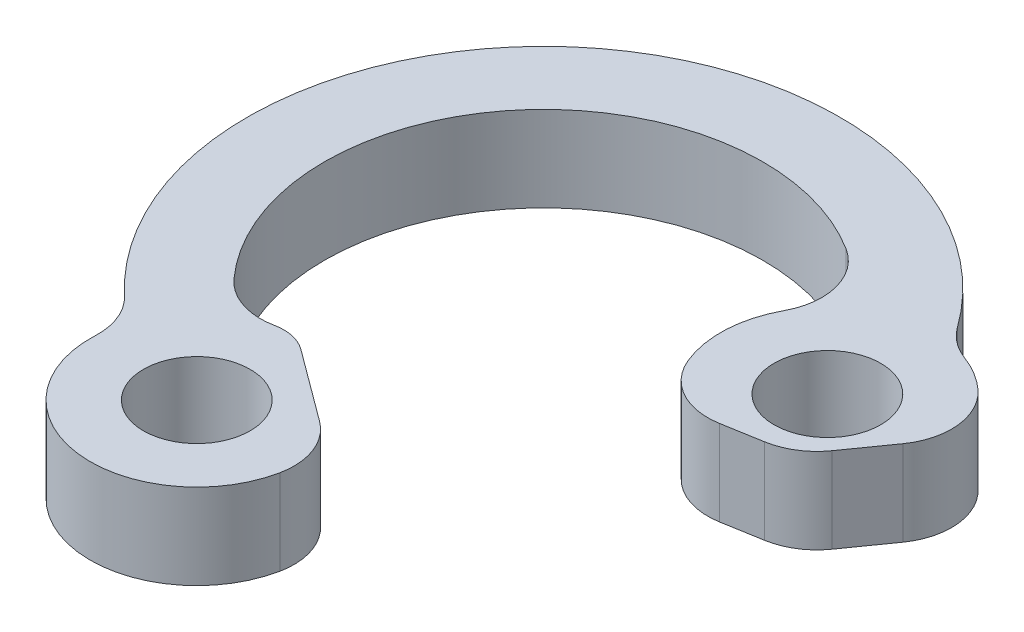
ISO-10303-21;
HEADER;
FILE_DESCRIPTION(('STEP AP214'),'2;1');
FILE_NAME('part.step','',(''),(''),'','','');
FILE_SCHEMA(('AUTOMOTIVE_DESIGN { 1 0 10303 214 1 1 1 1 }'));
ENDSEC;
DATA;
#1=APPLICATION_CONTEXT('core data for automotive mechanical design processes');
#2=APPLICATION_PROTOCOL_DEFINITION('international standard','automotive_design',2000,#1);
#3=PRODUCT_CONTEXT('',#1,'mechanical');
#4=PRODUCT('Part','Part','',(#3));
#5=PRODUCT_RELATED_PRODUCT_CATEGORY('part','',(#4));
#6=PRODUCT_DEFINITION_FORMATION('','',#4);
#7=PRODUCT_DEFINITION_CONTEXT('part definition',#1,'design');
#8=PRODUCT_DEFINITION('design','',#6,#7);
#9=PRODUCT_DEFINITION_SHAPE('','',#8);
#10=(LENGTH_UNIT() NAMED_UNIT(*) SI_UNIT(.MILLI.,.METRE.));
#11=(NAMED_UNIT(*) PLANE_ANGLE_UNIT() SI_UNIT($,.RADIAN.));
#12=(NAMED_UNIT(*) SI_UNIT($,.STERADIAN.) SOLID_ANGLE_UNIT());
#13=UNCERTAINTY_MEASURE_WITH_UNIT(LENGTH_MEASURE(1.E-05),#10,'distance_accuracy_value','');
#14=(GEOMETRIC_REPRESENTATION_CONTEXT(3) GLOBAL_UNCERTAINTY_ASSIGNED_CONTEXT((#13)) GLOBAL_UNIT_ASSIGNED_CONTEXT((#10,
#11,#12)) REPRESENTATION_CONTEXT('',''));
#15=CARTESIAN_POINT('',(0.,0.,0.));
#16=DIRECTION('',(0.,0.,1.));
#17=DIRECTION('',(1.,0.,0.));
#18=AXIS2_PLACEMENT_3D('',#15,#16,#17);
#19=CARTESIAN_POINT('',(87.073540725093,4.,-81.0463030698259));
#20=DIRECTION('',(0.,-1.,0.));
#21=DIRECTION('',(0.,0.,-1.));
#22=AXIS2_PLACEMENT_3D('',#19,#20,#21);
#23=CYLINDRICAL_SURFACE('',#22,5.00000000000037);
#24=CARTESIAN_POINT('',(87.073540725093,4.,-81.0463030698259));
#25=DIRECTION('',(0.,1.,0.));
#26=DIRECTION('',(0.,0.,1.));
#27=AXIS2_PLACEMENT_3D('',#24,#25,#26);
#28=CIRCLE('',#27,5.00000000000037);
#29=CARTESIAN_POINT('',(90.4170132831093,4.,-84.7639893467722));
#30=VERTEX_POINT('',#29);
#31=CARTESIAN_POINT('',(88.8112972997375,4.,-85.7346078900443));
#32=VERTEX_POINT('',#31);
#33=EDGE_CURVE('E303',#30,#32,#28,.T.);
#34=ORIENTED_EDGE('',*,*,#33,.F.);
#35=DIRECTION('',(0.,-1.,0.));
#36=VECTOR('',#35,1.);
#37=CARTESIAN_POINT('',(90.4170132831093,4.,-84.7639893467722));
#38=LINE('',#37,#36);
#39=CARTESIAN_POINT('',(90.4170132831093,0.,-84.7639893467722));
#40=VERTEX_POINT('',#39);
#41=EDGE_CURVE('E253',#30,#40,#38,.T.);
#42=ORIENTED_EDGE('',*,*,#41,.T.);
#43=CARTESIAN_POINT('',(87.073540725093,0.,-81.0463030698259));
#44=DIRECTION('',(0.,1.,0.));
#45=DIRECTION('',(0.,0.,1.));
#46=AXIS2_PLACEMENT_3D('',#43,#44,#45);
#47=CIRCLE('',#46,5.00000000000037);
#48=CARTESIAN_POINT('',(88.8112972997375,0.,-85.7346078900443));
#49=VERTEX_POINT('',#48);
#50=EDGE_CURVE('E276',#40,#49,#47,.T.);
#51=ORIENTED_EDGE('',*,*,#50,.T.);
#52=DIRECTION('',(0.,-1.,0.));
#53=VECTOR('',#52,1.);
#54=CARTESIAN_POINT('',(88.8112972997375,4.,-85.7346078900443));
#55=LINE('',#54,#53);
#56=EDGE_CURVE('E206',#49,#32,#55,.F.);
#57=ORIENTED_EDGE('',*,*,#56,.T.);
#58=EDGE_LOOP('',(#34,#42,#51,#57));
#59=FACE_BOUND('',#58,.T.);
#60=ADVANCED_FACE('F39',(#59),#23,.T.);
#61=CARTESIAN_POINT('',(82.6696468529154,0.,-83.4139429838754));
#62=VERTEX_POINT('',#61);
#63=CARTESIAN_POINT('',(82.4546959815146,0.,-79.1315515886351));
#64=VERTEX_POINT('',#63);
#65=EDGE_CURVE('E194',#62,#64,#47,.T.);
#66=ORIENTED_EDGE('',*,*,#65,.T.);
#67=DIRECTION('',(0.,-1.,0.));
#68=VECTOR('',#67,1.);
#69=CARTESIAN_POINT('',(82.4546959815146,4.,-79.1315515886351));
#70=LINE('',#69,#68);
#71=CARTESIAN_POINT('',(82.4546959815146,4.,-79.1315515886351));
#72=VERTEX_POINT('',#71);
#73=EDGE_CURVE('E255',#64,#72,#70,.F.);
#74=ORIENTED_EDGE('',*,*,#73,.T.);
#75=CARTESIAN_POINT('',(82.6696468529154,4.,-83.4139429838754));
#76=VERTEX_POINT('',#75);
#77=EDGE_CURVE('E284',#76,#72,#28,.T.);
#78=ORIENTED_EDGE('',*,*,#77,.F.);
#79=DIRECTION('',(0.,-1.,0.));
#80=VECTOR('',#79,1.);
#81=CARTESIAN_POINT('',(82.6696468529154,4.,-83.4139429838754));
#82=LINE('',#81,#80);
#83=EDGE_CURVE('E171',#76,#62,#82,.T.);
#84=ORIENTED_EDGE('',*,*,#83,.T.);
#85=EDGE_LOOP('',(#66,#74,#78,#84));
#86=FACE_BOUND('',#85,.T.);
#87=ADVANCED_FACE('F272',(#86),#23,.T.);
#88=CARTESIAN_POINT('',(76.1332406955767,4.,-78.6847831495273));
#89=DIRECTION('',(0.,-1.,0.));
#90=DIRECTION('',(0.,0.,-1.));
#91=AXIS2_PLACEMENT_3D('',#88,#89,#90);
#92=CYLINDRICAL_SURFACE('',#91,13.8977179632817);
#93=CARTESIAN_POINT('',(76.1332406955767,0.,-78.6847831495273));
#94=DIRECTION('',(0.,1.,0.));
#95=DIRECTION('',(0.,0.,1.));
#96=AXIS2_PLACEMENT_3D('',#93,#94,#95);
#97=CIRCLE('',#96,13.8977179632817);
#98=CARTESIAN_POINT('',(87.4179932212996,0.,-86.7965600831045));
#99=VERTEX_POINT('',#98);
#100=CARTESIAN_POINT('',(66.6039727055799,0.,-68.5684786779456));
#101=VERTEX_POINT('',#100);
#102=EDGE_CURVE('E189',#99,#101,#97,.T.);
#103=ORIENTED_EDGE('',*,*,#102,.T.);
#104=DIRECTION('',(0.,-1.,0.));
#105=VECTOR('',#104,1.);
#106=CARTESIAN_POINT('',(66.6039727055799,4.,-68.5684786779456));
#107=LINE('',#106,#105);
#108=CARTESIAN_POINT('',(66.6039727055799,4.,-68.5684786779456));
#109=VERTEX_POINT('',#108);
#110=EDGE_CURVE('E165',#101,#109,#107,.F.);
#111=ORIENTED_EDGE('',*,*,#110,.T.);
#112=CARTESIAN_POINT('',(76.1332406955767,4.,-78.6847831495273));
#113=DIRECTION('',(0.,1.,0.));
#114=DIRECTION('',(0.,0.,1.));
#115=AXIS2_PLACEMENT_3D('',#112,#113,#114);
#116=CIRCLE('',#115,13.8977179632817);
#117=CARTESIAN_POINT('',(87.4179932212996,4.,-86.7965600831045));
#118=VERTEX_POINT('',#117);
#119=EDGE_CURVE('E305',#118,#109,#116,.T.);
#120=ORIENTED_EDGE('',*,*,#119,.F.);
#121=DIRECTION('',(0.,-1.,0.));
#122=VECTOR('',#121,1.);
#123=CARTESIAN_POINT('',(87.4179932212996,4.,-86.7965600831045));
#124=LINE('',#123,#122);
#125=EDGE_CURVE('E182',#118,#99,#124,.T.);
#126=ORIENTED_EDGE('',*,*,#125,.T.);
#127=EDGE_LOOP('',(#103,#111,#120,#126));
#128=FACE_BOUND('',#127,.T.);
#129=ADVANCED_FACE('F329',(#128),#92,.T.);
#130=CARTESIAN_POINT('',(72.5386555288346,4.,-66.0203582136987));
#131=DIRECTION('',(0.,-1.,0.));
#132=DIRECTION('',(0.,0.,-1.));
#133=AXIS2_PLACEMENT_3D('',#130,#131,#132);
#134=CYLINDRICAL_SURFACE('',#133,5.);
#135=CARTESIAN_POINT('',(72.5386555288346,0.,-66.0203582136987));
#136=DIRECTION('',(0.,1.,0.));
#137=DIRECTION('',(0.,0.,1.));
#138=AXIS2_PLACEMENT_3D('',#135,#136,#137);
#139=CIRCLE('',#138,5.);
#140=CARTESIAN_POINT('',(67.5438448545858,0.,-66.2481000157703));
#141=VERTEX_POINT('',#140);
#142=CARTESIAN_POINT('',(77.43812650501,0.,-65.02276904294));
#143=VERTEX_POINT('',#142);
#144=EDGE_CURVE('E178',#141,#143,#139,.T.);
#145=ORIENTED_EDGE('',*,*,#144,.T.);
#146=DIRECTION('',(0.,-1.,0.));
#147=VECTOR('',#146,1.);
#148=CARTESIAN_POINT('',(77.43812650501,4.,-65.02276904294));
#149=LINE('',#148,#147);
#150=CARTESIAN_POINT('',(77.43812650501,4.,-65.02276904294));
#151=VERTEX_POINT('',#150);
#152=EDGE_CURVE('E228',#143,#151,#149,.F.);
#153=ORIENTED_EDGE('',*,*,#152,.T.);
#154=CARTESIAN_POINT('',(72.5386555288346,4.,-66.0203582136987));
#155=DIRECTION('',(0.,1.,0.));
#156=DIRECTION('',(0.,0.,1.));
#157=AXIS2_PLACEMENT_3D('',#154,#155,#156);
#158=CIRCLE('',#157,5.);
#159=CARTESIAN_POINT('',(67.5438448545858,4.,-66.2481000157703));
#160=VERTEX_POINT('',#159);
#161=EDGE_CURVE('E181',#160,#151,#158,.T.);
#162=ORIENTED_EDGE('',*,*,#161,.F.);
#163=DIRECTION('',(0.,-1.,0.));
#164=VECTOR('',#163,1.);
#165=CARTESIAN_POINT('',(67.5438448545858,4.,-66.2481000157703));
#166=LINE('',#165,#164);
#167=EDGE_CURVE('E164',#160,#141,#166,.T.);
#168=ORIENTED_EDGE('',*,*,#167,.T.);
#169=EDGE_LOOP('',(#145,#153,#162,#168));
#170=FACE_BOUND('',#169,.T.);
#171=ADVANCED_FACE('F176',(#170),#134,.T.);
#172=CARTESIAN_POINT('',(72.5386555288346,4.,-66.0203582136987));
#173=DIRECTION('',(0.,-1.,0.));
#174=DIRECTION('',(0.,0.,-1.));
#175=AXIS2_PLACEMENT_3D('',#172,#173,#174);
#176=CYLINDRICAL_SURFACE('',#175,2.5);
#177=CARTESIAN_POINT('',(72.5386555288346,4.,-66.0203582136987));
#178=DIRECTION('',(0.,1.,0.));
#179=DIRECTION('',(0.,0.,1.));
#180=AXIS2_PLACEMENT_3D('',#177,#178,#179);
#181=CIRCLE('',#180,2.5);
#182=CARTESIAN_POINT('',(72.5386555288346,4.,-63.5203582136987));
#183=VERTEX_POINT('',#182);
#184=EDGE_CURVE('E300',#183,#183,#181,.T.);
#185=ORIENTED_EDGE('',*,*,#184,.T.);
#186=EDGE_LOOP('',(#185));
#187=FACE_BOUND('',#186,.T.);
#188=CARTESIAN_POINT('',(72.5386555288346,0.,-66.0203582136987));
#189=DIRECTION('',(0.,1.,0.));
#190=DIRECTION('',(0.,0.,1.));
#191=AXIS2_PLACEMENT_3D('',#188,#189,#190);
#192=CIRCLE('',#191,2.5);
#193=CARTESIAN_POINT('',(72.5386555288346,0.,-63.5203582136987));
#194=VERTEX_POINT('',#193);
#195=EDGE_CURVE('E313',#194,#194,#192,.T.);
#196=ORIENTED_EDGE('',*,*,#195,.F.);
#197=EDGE_LOOP('',(#196));
#198=FACE_BOUND('',#197,.T.);
#199=ADVANCED_FACE('F337',(#187,#198),#176,.F.);
#200=CARTESIAN_POINT('',(87.073540725093,4.,-81.0463030698259));
#201=DIRECTION('',(0.,-1.,0.));
#202=DIRECTION('',(0.,0.,-1.));
#203=AXIS2_PLACEMENT_3D('',#200,#201,#202);
#204=CYLINDRICAL_SURFACE('',#203,2.5);
#205=CARTESIAN_POINT('',(87.073540725093,4.,-81.0463030698259));
#206=DIRECTION('',(0.,1.,0.));
#207=DIRECTION('',(0.,0.,1.));
#208=AXIS2_PLACEMENT_3D('',#205,#206,#207);
#209=CIRCLE('',#208,2.5);
#210=CARTESIAN_POINT('',(87.073540725093,4.,-78.5463030698259));
#211=VERTEX_POINT('',#210);
#212=EDGE_CURVE('E192',#211,#211,#209,.T.);
#213=ORIENTED_EDGE('',*,*,#212,.T.);
#214=EDGE_LOOP('',(#213));
#215=FACE_BOUND('',#214,.T.);
#216=CARTESIAN_POINT('',(87.073540725093,0.,-81.0463030698259));
#217=DIRECTION('',(0.,1.,0.));
#218=DIRECTION('',(0.,0.,1.));
#219=AXIS2_PLACEMENT_3D('',#216,#217,#218);
#220=CIRCLE('',#219,2.5);
#221=CARTESIAN_POINT('',(87.073540725093,0.,-78.5463030698259));
#222=VERTEX_POINT('',#221);
#223=EDGE_CURVE('E297',#222,#222,#220,.T.);
#224=ORIENTED_EDGE('',*,*,#223,.F.);
#225=EDGE_LOOP('',(#224));
#226=FACE_BOUND('',#225,.T.);
#227=ADVANCED_FACE('F349',(#215,#226),#204,.F.);
#228=CARTESIAN_POINT('',(76.1332406955767,4.,-78.6847831495273));
#229=DIRECTION('',(0.,-1.,0.));
#230=DIRECTION('',(0.,0.,-1.));
#231=AXIS2_PLACEMENT_3D('',#228,#229,#230);
#232=CYLINDRICAL_SURFACE('',#231,10.2789510553467);
#233=CARTESIAN_POINT('',(76.1332406955767,4.,-78.6847831495273));
#234=DIRECTION('',(0.,1.,0.));
#235=DIRECTION('',(0.,0.,1.));
#236=AXIS2_PLACEMENT_3D('',#233,#234,#235);
#237=CIRCLE('',#236,10.2789510553467);
#238=CARTESIAN_POINT('',(81.6322408847205,4.,-87.369127207544));
#239=VERTEX_POINT('',#238);
#240=CARTESIAN_POINT('',(68.4970170332686,4.,-71.80401844076));
#241=VERTEX_POINT('',#240);
#242=EDGE_CURVE('E183',#239,#241,#237,.T.);
#243=ORIENTED_EDGE('',*,*,#242,.T.);
#244=DIRECTION('',(0.,-1.,0.));
#245=VECTOR('',#244,1.);
#246=CARTESIAN_POINT('',(68.4970170332686,4.,-71.80401844076));
#247=LINE('',#246,#245);
#248=CARTESIAN_POINT('',(68.4970170332686,0.,-71.80401844076));
#249=VERTEX_POINT('',#248);
#250=EDGE_CURVE('E203',#241,#249,#247,.T.);
#251=ORIENTED_EDGE('',*,*,#250,.T.);
#252=CARTESIAN_POINT('',(76.1332406955767,0.,-78.6847831495273));
#253=DIRECTION('',(0.,1.,0.));
#254=DIRECTION('',(0.,0.,1.));
#255=AXIS2_PLACEMENT_3D('',#252,#253,#254);
#256=CIRCLE('',#255,10.2789510553467);
#257=CARTESIAN_POINT('',(81.6322408847205,0.,-87.369127207544));
#258=VERTEX_POINT('',#257);
#259=EDGE_CURVE('E188',#258,#249,#256,.T.);
#260=ORIENTED_EDGE('',*,*,#259,.F.);
#261=DIRECTION('',(0.,-1.,0.));
#262=VECTOR('',#261,1.);
#263=CARTESIAN_POINT('',(81.6322408847205,4.,-87.369127207544));
#264=LINE('',#263,#262);
#265=EDGE_CURVE('E201',#258,#239,#264,.F.);
#266=ORIENTED_EDGE('',*,*,#265,.T.);
#267=EDGE_LOOP('',(#243,#251,#260,#266));
#268=FACE_BOUND('',#267,.T.);
#269=ADVANCED_FACE('F352',(#268),#232,.F.);
#270=CARTESIAN_POINT('',(0.,4.,0.));
#271=DIRECTION('',(0.,1.,0.));
#272=DIRECTION('',(0.,0.,1.));
#273=AXIS2_PLACEMENT_3D('',#270,#271,#272);
#274=PLANE('',#273);
#275=ORIENTED_EDGE('',*,*,#77,.T.);
#276=CARTESIAN_POINT('',(85.2260028276614,4.,-80.2804024773495));
#277=DIRECTION('',(0.,1.,0.));
#278=DIRECTION('',(0.,0.,1.));
#279=AXIS2_PLACEMENT_3D('',#276,#277,#278);
#280=CIRCLE('',#279,3.);
#281=CARTESIAN_POINT('',(85.735483711979,4.,-77.3239807840664));
#282=VERTEX_POINT('',#281);
#283=EDGE_CURVE('E260',#72,#282,#280,.T.);
#284=ORIENTED_EDGE('',*,*,#283,.T.);
#285=DIRECTION('',(-0.985473897761035,0.,0.169826961439203));
#286=VECTOR('',#285,1.);
#287=CARTESIAN_POINT('',(88.7700332886994,4.,-77.8469254659315));
#288=LINE('',#287,#286);
#289=CARTESIAN_POINT('',(87.5472284238743,4.,-77.6361992000221));
#290=VERTEX_POINT('',#289);
#291=EDGE_CURVE('E282',#290,#282,#288,.T.);
#292=ORIENTED_EDGE('',*,*,#291,.F.);
#293=CARTESIAN_POINT('',(87.0377475395567,4.,-80.5926208933053));
#294=DIRECTION('',(0.,1.,0.));
#295=DIRECTION('',(0.,0.,1.));
#296=AXIS2_PLACEMENT_3D('',#293,#294,#295);
#297=CIRCLE('',#296,3.);
#298=CARTESIAN_POINT('',(89.4867256076639,4.,-78.8598466951104));
#299=VERTEX_POINT('',#298);
#300=EDGE_CURVE('E258',#290,#299,#297,.T.);
#301=ORIENTED_EDGE('',*,*,#300,.T.);
#302=DIRECTION('',(-0.577591399398297,0.,0.816326022702399));
#303=VECTOR('',#302,1.);
#304=CARTESIAN_POINT('',(91.9156832743271,4.,-82.2927602623921));
#305=LINE('',#304,#303);
#306=CARTESIAN_POINT('',(90.8599078164069,4.,-80.8006033824097));
#307=VERTEX_POINT('',#306);
#308=EDGE_CURVE('E287',#307,#299,#305,.T.);
#309=ORIENTED_EDGE('',*,*,#308,.F.);
#310=CARTESIAN_POINT('',(88.4109297482997,4.,-82.5333775806046));
#311=DIRECTION('',(0.,1.,0.));
#312=DIRECTION('',(0.,0.,1.));
#313=AXIS2_PLACEMENT_3D('',#310,#311,#312);
#314=CIRCLE('',#313,3.);
#315=EDGE_CURVE('E246',#307,#30,#314,.T.);
#316=ORIENTED_EDGE('',*,*,#315,.T.);
#317=ORIENTED_EDGE('',*,*,#33,.T.);
#318=CARTESIAN_POINT('',(89.8539512445242,4.,-88.5475907821751));
#319=DIRECTION('',(0.,1.,0.));
#320=DIRECTION('',(0.,0.,1.));
#321=AXIS2_PLACEMENT_3D('',#318,#319,#320);
#322=CIRCLE('',#321,3.);
#323=EDGE_CURVE('E224',#32,#118,#322,.F.);
#324=ORIENTED_EDGE('',*,*,#323,.T.);
#325=ORIENTED_EDGE('',*,*,#119,.T.);
#326=CARTESIAN_POINT('',(64.5469584500366,4.,-66.3847450970133));
#327=DIRECTION('',(0.,1.,0.));
#328=DIRECTION('',(0.,0.,1.));
#329=AXIS2_PLACEMENT_3D('',#326,#327,#328);
#330=CIRCLE('',#329,3.);
#331=EDGE_CURVE('E170',#109,#160,#330,.F.);
#332=ORIENTED_EDGE('',*,*,#331,.T.);
#333=ORIENTED_EDGE('',*,*,#161,.T.);
#334=CARTESIAN_POINT('',(74.4984439193047,4.,-65.6213225453952));
#335=DIRECTION('',(0.,1.,0.));
#336=DIRECTION('',(0.,0.,1.));
#337=AXIS2_PLACEMENT_3D('',#334,#335,#336);
#338=CIRCLE('',#337,3.);
#339=CARTESIAN_POINT('',(76.2816528178533,4.,-68.0338245711223));
#340=VERTEX_POINT('',#339);
#341=EDGE_CURVE('E230',#151,#340,#338,.T.);
#342=ORIENTED_EDGE('',*,*,#341,.T.);
#343=DIRECTION('',(0.804167341909032,0.,0.594402966182843));
#344=VECTOR('',#343,1.);
#345=CARTESIAN_POINT('',(59.4715744385155,4.,-80.4590499312125));
#346=LINE('',#345,#344);
#347=CARTESIAN_POINT('',(72.9156523362023,4.,-70.5218150255924));
#348=VERTEX_POINT('',#347);
#349=EDGE_CURVE('E293',#348,#340,#346,.T.);
#350=ORIENTED_EDGE('',*,*,#349,.F.);
#351=CARTESIAN_POINT('',(71.7268464038366,4.,-68.9134803417743));
#352=DIRECTION('',(0.,1.,0.));
#353=DIRECTION('',(0.,0.,1.));
#354=AXIS2_PLACEMENT_3D('',#351,#352,#353);
#355=CIRCLE('',#354,2.);
#356=CARTESIAN_POINT('',(71.3263935959633,4.,-70.8729796524826));
#357=VERTEX_POINT('',#356);
#358=EDGE_CURVE('E244',#348,#357,#355,.T.);
#359=ORIENTED_EDGE('',*,*,#358,.T.);
#360=CARTESIAN_POINT('',(70.7257143841533,4.,-73.8122286185451));
#361=DIRECTION('',(0.,1.,0.));
#362=DIRECTION('',(0.,0.,1.));
#363=AXIS2_PLACEMENT_3D('',#360,#361,#362);
#364=CIRCLE('',#363,3.);
#365=EDGE_CURVE('E215',#357,#241,#364,.F.);
#366=ORIENTED_EDGE('',*,*,#365,.T.);
#367=ORIENTED_EDGE('',*,*,#242,.F.);
#368=CARTESIAN_POINT('',(80.027310529609,4.,-84.834526932305));
#369=DIRECTION('',(0.,1.,0.));
#370=DIRECTION('',(0.,0.,1.));
#371=AXIS2_PLACEMENT_3D('',#368,#369,#370);
#372=CIRCLE('',#371,3.);
#373=EDGE_CURVE('E219',#239,#76,#372,.F.);
#374=ORIENTED_EDGE('',*,*,#373,.T.);
#375=EDGE_LOOP('',(#275,#284,#292,#301,#309,#316,#317,#324,#325,#332,#333,#342,#350,#359,#366,
#367,#374));
#376=FACE_BOUND('',#375,.T.);
#377=ORIENTED_EDGE('',*,*,#212,.F.);
#378=EDGE_LOOP('',(#377));
#379=FACE_BOUND('',#378,.T.);
#380=ORIENTED_EDGE('',*,*,#184,.F.);
#381=EDGE_LOOP('',(#380));
#382=FACE_BOUND('',#381,.T.);
#383=ADVANCED_FACE('F280',(#376,#379,#382),#274,.T.);
#384=CARTESIAN_POINT('',(0.,0.,0.));
#385=DIRECTION('',(0.,1.,0.));
#386=DIRECTION('',(0.,0.,1.));
#387=AXIS2_PLACEMENT_3D('',#384,#385,#386);
#388=PLANE('',#387);
#389=ORIENTED_EDGE('',*,*,#223,.T.);
#390=EDGE_LOOP('',(#389));
#391=FACE_BOUND('',#390,.T.);
#392=ORIENTED_EDGE('',*,*,#195,.T.);
#393=EDGE_LOOP('',(#392));
#394=FACE_BOUND('',#393,.T.);
#395=DIRECTION('',(-0.985473897761036,0.,0.169826961439203));
#396=VECTOR('',#395,1.);
#397=CARTESIAN_POINT('',(-10.4682303728674,0.,-60.745170853824));
#398=LINE('',#397,#396);
#399=CARTESIAN_POINT('',(87.5472284238744,0.,-77.6361992000221));
#400=VERTEX_POINT('',#399);
#401=CARTESIAN_POINT('',(85.7354837119791,0.,-77.3239807840664));
#402=VERTEX_POINT('',#401);
#403=EDGE_CURVE('E268',#400,#402,#398,.T.);
#404=ORIENTED_EDGE('',*,*,#403,.T.);
#405=CARTESIAN_POINT('',(85.2260028276614,0.,-80.2804024773495));
#406=DIRECTION('',(0.,1.,0.));
#407=DIRECTION('',(0.,0.,1.));
#408=AXIS2_PLACEMENT_3D('',#405,#406,#407);
#409=CIRCLE('',#408,3.);
#410=EDGE_CURVE('E47',#402,#64,#409,.F.);
#411=ORIENTED_EDGE('',*,*,#410,.T.);
#412=ORIENTED_EDGE('',*,*,#65,.F.);
#413=CARTESIAN_POINT('',(80.027310529609,0.,-84.834526932305));
#414=DIRECTION('',(0.,1.,0.));
#415=DIRECTION('',(0.,0.,1.));
#416=AXIS2_PLACEMENT_3D('',#413,#414,#415);
#417=CIRCLE('',#416,3.);
#418=EDGE_CURVE('E217',#62,#258,#417,.T.);
#419=ORIENTED_EDGE('',*,*,#418,.T.);
#420=ORIENTED_EDGE('',*,*,#259,.T.);
#421=CARTESIAN_POINT('',(70.7257143841533,0.,-73.8122286185451));
#422=DIRECTION('',(0.,1.,0.));
#423=DIRECTION('',(0.,0.,1.));
#424=AXIS2_PLACEMENT_3D('',#421,#422,#423);
#425=CIRCLE('',#424,3.);
#426=CARTESIAN_POINT('',(71.3263935959633,0.,-70.8729796524826));
#427=VERTEX_POINT('',#426);
#428=EDGE_CURVE('E212',#249,#427,#425,.T.);
#429=ORIENTED_EDGE('',*,*,#428,.T.);
#430=CARTESIAN_POINT('',(71.7268464038366,0.,-68.9134803417743));
#431=DIRECTION('',(0.,1.,0.));
#432=DIRECTION('',(0.,0.,1.));
#433=AXIS2_PLACEMENT_3D('',#430,#431,#432);
#434=CIRCLE('',#433,2.);
#435=CARTESIAN_POINT('',(72.9156523362023,0.,-70.5218150255924));
#436=VERTEX_POINT('',#435);
#437=EDGE_CURVE('E240',#427,#436,#434,.F.);
#438=ORIENTED_EDGE('',*,*,#437,.T.);
#439=DIRECTION('',(0.804167341909032,0.,0.594402966182843));
#440=VECTOR('',#439,1.);
#441=CARTESIAN_POINT('',(59.4715744385155,0.,-80.4590499312125));
#442=LINE('',#441,#440);
#443=CARTESIAN_POINT('',(76.2816528178533,0.,-68.0338245711223));
#444=VERTEX_POINT('',#443);
#445=EDGE_CURVE('E226',#436,#444,#442,.T.);
#446=ORIENTED_EDGE('',*,*,#445,.T.);
#447=CARTESIAN_POINT('',(74.4984439193047,0.,-65.6213225453952));
#448=DIRECTION('',(0.,1.,0.));
#449=DIRECTION('',(0.,0.,1.));
#450=AXIS2_PLACEMENT_3D('',#447,#448,#449);
#451=CIRCLE('',#450,3.);
#452=EDGE_CURVE('E187',#444,#143,#451,.F.);
#453=ORIENTED_EDGE('',*,*,#452,.T.);
#454=ORIENTED_EDGE('',*,*,#144,.F.);
#455=CARTESIAN_POINT('',(64.5469584500366,0.,-66.3847450970133));
#456=DIRECTION('',(0.,1.,0.));
#457=DIRECTION('',(0.,0.,1.));
#458=AXIS2_PLACEMENT_3D('',#455,#456,#457);
#459=CIRCLE('',#458,3.);
#460=EDGE_CURVE('E160',#141,#101,#459,.T.);
#461=ORIENTED_EDGE('',*,*,#460,.T.);
#462=ORIENTED_EDGE('',*,*,#102,.F.);
#463=CARTESIAN_POINT('',(89.8539512445242,0.,-88.5475907821751));
#464=DIRECTION('',(0.,1.,0.));
#465=DIRECTION('',(0.,0.,1.));
#466=AXIS2_PLACEMENT_3D('',#463,#464,#465);
#467=CIRCLE('',#466,3.);
#468=EDGE_CURVE('E221',#99,#49,#467,.T.);
#469=ORIENTED_EDGE('',*,*,#468,.T.);
#470=ORIENTED_EDGE('',*,*,#50,.F.);
#471=CARTESIAN_POINT('',(88.4109297482997,0.,-82.5333775806046));
#472=DIRECTION('',(0.,1.,0.));
#473=DIRECTION('',(0.,0.,1.));
#474=AXIS2_PLACEMENT_3D('',#471,#472,#473);
#475=CIRCLE('',#474,3.);
#476=CARTESIAN_POINT('',(90.8599078164069,0.,-80.8006033824097));
#477=VERTEX_POINT('',#476);
#478=EDGE_CURVE('E251',#40,#477,#475,.F.);
#479=ORIENTED_EDGE('',*,*,#478,.T.);
#480=DIRECTION('',(-0.577591399398297,0.,0.816326022702399));
#481=VECTOR('',#480,1.);
#482=CARTESIAN_POINT('',(91.9156832743271,0.,-82.2927602623921));
#483=LINE('',#482,#481);
#484=CARTESIAN_POINT('',(89.4867256076639,0.,-78.8598466951104));
#485=VERTEX_POINT('',#484);
#486=EDGE_CURVE('E290',#477,#485,#483,.T.);
#487=ORIENTED_EDGE('',*,*,#486,.T.);
#488=CARTESIAN_POINT('',(87.0377475395567,0.,-80.5926208933053));
#489=DIRECTION('',(0.,1.,0.));
#490=DIRECTION('',(0.,0.,1.));
#491=AXIS2_PLACEMENT_3D('',#488,#489,#490);
#492=CIRCLE('',#491,3.);
#493=EDGE_CURVE('E54',#485,#400,#492,.F.);
#494=ORIENTED_EDGE('',*,*,#493,.T.);
#495=EDGE_LOOP('',(#404,#411,#412,#419,#420,#429,#438,#446,#453,#454,#461,#462,#469,#470,#479,
#487,#494));
#496=FACE_BOUND('',#495,.T.);
#497=ADVANCED_FACE('F185',(#391,#394,#496),#388,.F.);
#498=CARTESIAN_POINT('',(64.5469584500366,4.,-66.3847450970133));
#499=DIRECTION('',(0.,1.,0.));
#500=DIRECTION('',(0.,0.,1.));
#501=AXIS2_PLACEMENT_3D('',#498,#499,#500);
#502=CYLINDRICAL_SURFACE('',#501,3.);
#503=ORIENTED_EDGE('',*,*,#331,.F.);
#504=ORIENTED_EDGE('',*,*,#110,.F.);
#505=ORIENTED_EDGE('',*,*,#460,.F.);
#506=ORIENTED_EDGE('',*,*,#167,.F.);
#507=EDGE_LOOP('',(#503,#504,#505,#506));
#508=FACE_BOUND('',#507,.T.);
#509=ADVANCED_FACE('F163',(#508),#502,.F.);
#510=CARTESIAN_POINT('',(70.7257143841533,4.,-73.8122286185451));
#511=DIRECTION('',(0.,-1.,0.));
#512=DIRECTION('',(0.,0.,-1.));
#513=AXIS2_PLACEMENT_3D('',#510,#511,#512);
#514=CYLINDRICAL_SURFACE('',#513,3.);
#515=ORIENTED_EDGE('',*,*,#365,.F.);
#516=DIRECTION('',(0.,-1.,0.));
#517=VECTOR('',#516,1.);
#518=CARTESIAN_POINT('',(71.3263935959633,4.,-70.8729796524826));
#519=LINE('',#518,#517);
#520=EDGE_CURVE('E237',#357,#427,#519,.T.);
#521=ORIENTED_EDGE('',*,*,#520,.T.);
#522=ORIENTED_EDGE('',*,*,#428,.F.);
#523=ORIENTED_EDGE('',*,*,#250,.F.);
#524=EDGE_LOOP('',(#515,#521,#522,#523));
#525=FACE_BOUND('',#524,.T.);
#526=ADVANCED_FACE('F356',(#525),#514,.F.);
#527=CARTESIAN_POINT('',(80.027310529609,4.,-84.834526932305));
#528=DIRECTION('',(0.,-1.,0.));
#529=DIRECTION('',(0.,0.,-1.));
#530=AXIS2_PLACEMENT_3D('',#527,#528,#529);
#531=CYLINDRICAL_SURFACE('',#530,3.);
#532=ORIENTED_EDGE('',*,*,#373,.F.);
#533=ORIENTED_EDGE('',*,*,#265,.F.);
#534=ORIENTED_EDGE('',*,*,#418,.F.);
#535=ORIENTED_EDGE('',*,*,#83,.F.);
#536=EDGE_LOOP('',(#532,#533,#534,#535));
#537=FACE_BOUND('',#536,.T.);
#538=ADVANCED_FACE('F359',(#537),#531,.F.);
#539=CARTESIAN_POINT('',(89.8539512445242,4.,-88.5475907821751));
#540=DIRECTION('',(0.,1.,0.));
#541=DIRECTION('',(0.,0.,1.));
#542=AXIS2_PLACEMENT_3D('',#539,#540,#541);
#543=CYLINDRICAL_SURFACE('',#542,3.);
#544=ORIENTED_EDGE('',*,*,#323,.F.);
#545=ORIENTED_EDGE('',*,*,#56,.F.);
#546=ORIENTED_EDGE('',*,*,#468,.F.);
#547=ORIENTED_EDGE('',*,*,#125,.F.);
#548=EDGE_LOOP('',(#544,#545,#546,#547));
#549=FACE_BOUND('',#548,.T.);
#550=ADVANCED_FACE('F326',(#549),#543,.F.);
#551=CARTESIAN_POINT('',(78.0636530690193,7.,-66.7166531568777));
#552=DIRECTION('',(-0.594402966182843,0.,0.804167341909032));
#553=DIRECTION('',(0.804167341909032,0.,0.594402966182843));
#554=AXIS2_PLACEMENT_3D('',#551,#552,#553);
#555=PLANE('',#554);
#556=ORIENTED_EDGE('',*,*,#445,.F.);
#557=DIRECTION('',(0.,-1.,0.));
#558=VECTOR('',#557,1.);
#559=CARTESIAN_POINT('',(72.9156523362023,7.,-70.5218150255923));
#560=LINE('',#559,#558);
#561=EDGE_CURVE('E242',#436,#348,#560,.F.);
#562=ORIENTED_EDGE('',*,*,#561,.T.);
#563=ORIENTED_EDGE('',*,*,#349,.T.);
#564=DIRECTION('',(0.,-1.,0.));
#565=VECTOR('',#564,1.);
#566=CARTESIAN_POINT('',(76.2816528178533,7.,-68.0338245711223));
#567=LINE('',#566,#565);
#568=EDGE_CURVE('E233',#340,#444,#567,.T.);
#569=ORIENTED_EDGE('',*,*,#568,.T.);
#570=EDGE_LOOP('',(#556,#562,#563,#569));
#571=FACE_BOUND('',#570,.T.);
#572=ADVANCED_FACE('F366',(#571),#555,.F.);
#573=CARTESIAN_POINT('',(74.4984439193047,4.,-65.6213225453952));
#574=DIRECTION('',(0.,-1.,0.));
#575=DIRECTION('',(0.,0.,-1.));
#576=AXIS2_PLACEMENT_3D('',#573,#574,#575);
#577=CYLINDRICAL_SURFACE('',#576,3.);
#578=ORIENTED_EDGE('',*,*,#452,.F.);
#579=ORIENTED_EDGE('',*,*,#568,.F.);
#580=ORIENTED_EDGE('',*,*,#341,.F.);
#581=ORIENTED_EDGE('',*,*,#152,.F.);
#582=EDGE_LOOP('',(#578,#579,#580,#581));
#583=FACE_BOUND('',#582,.T.);
#584=ADVANCED_FACE('F367',(#583),#577,.T.);
#585=CARTESIAN_POINT('',(71.7268464038366,4.,-68.9134803417743));
#586=DIRECTION('',(0.,-1.,0.));
#587=DIRECTION('',(0.,0.,-1.));
#588=AXIS2_PLACEMENT_3D('',#585,#586,#587);
#589=CYLINDRICAL_SURFACE('',#588,2.);
#590=ORIENTED_EDGE('',*,*,#358,.F.);
#591=ORIENTED_EDGE('',*,*,#561,.F.);
#592=ORIENTED_EDGE('',*,*,#437,.F.);
#593=ORIENTED_EDGE('',*,*,#520,.F.);
#594=EDGE_LOOP('',(#590,#591,#592,#593));
#595=FACE_BOUND('',#594,.T.);
#596=ADVANCED_FACE('F370',(#595),#589,.T.);
#597=CARTESIAN_POINT('',(91.9156832743271,0.,-82.2927602623921));
#598=DIRECTION('',(-0.816326022702399,0.,-0.577591399398297));
#599=DIRECTION('',(-0.577591399398297,0.,0.816326022702399));
#600=AXIS2_PLACEMENT_3D('',#597,#598,#599);
#601=PLANE('',#600);
#602=ORIENTED_EDGE('',*,*,#308,.T.);
#603=DIRECTION('',(0.,-1.,0.));
#604=VECTOR('',#603,1.);
#605=CARTESIAN_POINT('',(89.4867256076639,0.,-78.8598466951104));
#606=LINE('',#605,#604);
#607=EDGE_CURVE('E11',#299,#485,#606,.T.);
#608=ORIENTED_EDGE('',*,*,#607,.T.);
#609=ORIENTED_EDGE('',*,*,#486,.F.);
#610=DIRECTION('',(0.,-1.,0.));
#611=VECTOR('',#610,1.);
#612=CARTESIAN_POINT('',(90.8599078164069,0.,-80.8006033824097));
#613=LINE('',#612,#611);
#614=EDGE_CURVE('E248',#477,#307,#613,.F.);
#615=ORIENTED_EDGE('',*,*,#614,.T.);
#616=EDGE_LOOP('',(#602,#608,#609,#615));
#617=FACE_BOUND('',#616,.T.);
#618=ADVANCED_FACE('F373',(#617),#601,.F.);
#619=CARTESIAN_POINT('',(88.4109297482997,4.,-82.5333775806046));
#620=DIRECTION('',(0.,-1.,0.));
#621=DIRECTION('',(0.,0.,-1.));
#622=AXIS2_PLACEMENT_3D('',#619,#620,#621);
#623=CYLINDRICAL_SURFACE('',#622,3.);
#624=ORIENTED_EDGE('',*,*,#478,.F.);
#625=ORIENTED_EDGE('',*,*,#41,.F.);
#626=ORIENTED_EDGE('',*,*,#315,.F.);
#627=ORIENTED_EDGE('',*,*,#614,.F.);
#628=EDGE_LOOP('',(#624,#625,#626,#627));
#629=FACE_BOUND('',#628,.T.);
#630=ADVANCED_FACE('F375',(#629),#623,.T.);
#631=CARTESIAN_POINT('',(88.7700332886994,-1.,-77.8469254659315));
#632=DIRECTION('',(-0.169826961439203,0.,-0.985473897761035));
#633=DIRECTION('',(-0.985473897761036,0.,0.169826961439203));
#634=AXIS2_PLACEMENT_3D('',#631,#632,#633);
#635=PLANE('',#634);
#636=ORIENTED_EDGE('',*,*,#291,.T.);
#637=DIRECTION('',(0.,-1.,0.));
#638=VECTOR('',#637,1.);
#639=CARTESIAN_POINT('',(85.735483711979,-1.,-77.3239807840664));
#640=LINE('',#639,#638);
#641=EDGE_CURVE('E61',#282,#402,#640,.T.);
#642=ORIENTED_EDGE('',*,*,#641,.T.);
#643=ORIENTED_EDGE('',*,*,#403,.F.);
#644=DIRECTION('',(0.,-1.,0.));
#645=VECTOR('',#644,1.);
#646=CARTESIAN_POINT('',(87.5472284238743,-1.,-77.6361992000221));
#647=LINE('',#646,#645);
#648=EDGE_CURVE('E262',#400,#290,#647,.F.);
#649=ORIENTED_EDGE('',*,*,#648,.T.);
#650=EDGE_LOOP('',(#636,#642,#643,#649));
#651=FACE_BOUND('',#650,.T.);
#652=ADVANCED_FACE('F285',(#651),#635,.F.);
#653=CARTESIAN_POINT('',(85.2260028276614,4.,-80.2804024773495));
#654=DIRECTION('',(0.,-1.,0.));
#655=DIRECTION('',(0.,0.,-1.));
#656=AXIS2_PLACEMENT_3D('',#653,#654,#655);
#657=CYLINDRICAL_SURFACE('',#656,3.);
#658=ORIENTED_EDGE('',*,*,#410,.F.);
#659=ORIENTED_EDGE('',*,*,#641,.F.);
#660=ORIENTED_EDGE('',*,*,#283,.F.);
#661=ORIENTED_EDGE('',*,*,#73,.F.);
#662=EDGE_LOOP('',(#658,#659,#660,#661));
#663=FACE_BOUND('',#662,.T.);
#664=ADVANCED_FACE('F277',(#663),#657,.T.);
#665=CARTESIAN_POINT('',(87.0377475395567,0.,-80.5926208933053));
#666=DIRECTION('',(0.,-1.,0.));
#667=DIRECTION('',(0.,0.,-1.));
#668=AXIS2_PLACEMENT_3D('',#665,#666,#667);
#669=CYLINDRICAL_SURFACE('',#668,3.);
#670=ORIENTED_EDGE('',*,*,#300,.F.);
#671=ORIENTED_EDGE('',*,*,#648,.F.);
#672=ORIENTED_EDGE('',*,*,#493,.F.);
#673=ORIENTED_EDGE('',*,*,#607,.F.);
#674=EDGE_LOOP('',(#670,#671,#672,#673));
#675=FACE_BOUND('',#674,.T.);
#676=ADVANCED_FACE('F41',(#675),#669,.T.);
#677=CLOSED_SHELL('',(#60,#87,#129,#171,#199,#227,#269,#383,#497,#509,#526,#538,#550,#572,#584,
#596,#618,#630,#652,#664,#676));
#678=MANIFOLD_SOLID_BREP('B2',#677);
#679=ADVANCED_BREP_SHAPE_REPRESENTATION('',(#18,#678),#14);
#680=SHAPE_DEFINITION_REPRESENTATION(#9,#679);
ENDSEC;
END-ISO-10303-21;
